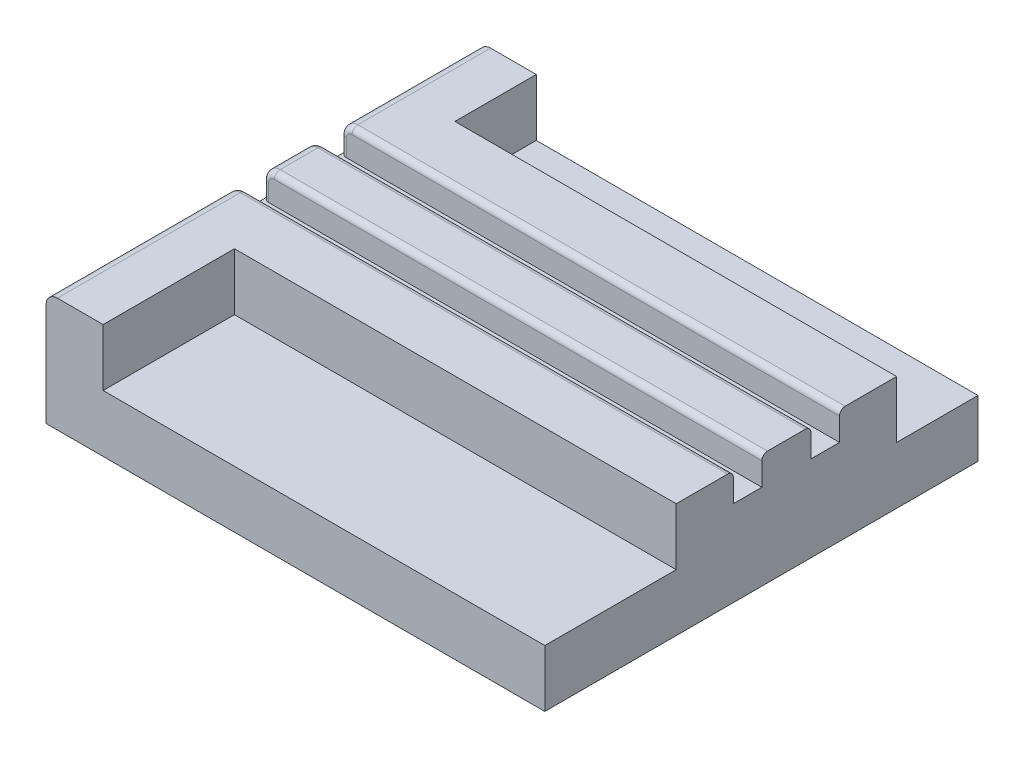
ISO-10303-21;
HEADER;
FILE_DESCRIPTION(('STEP AP214'),'2;1');
FILE_NAME('part.step','',(''),(''),'','','');
FILE_SCHEMA(('AUTOMOTIVE_DESIGN { 1 0 10303 214 1 1 1 1 }'));
ENDSEC;
DATA;
#1=APPLICATION_CONTEXT('core data for automotive mechanical design processes');
#2=APPLICATION_PROTOCOL_DEFINITION('international standard','automotive_design',2000,#1);
#3=PRODUCT_CONTEXT('',#1,'mechanical');
#4=PRODUCT('Part','Part','',(#3));
#5=PRODUCT_RELATED_PRODUCT_CATEGORY('part','',(#4));
#6=PRODUCT_DEFINITION_FORMATION('','',#4);
#7=PRODUCT_DEFINITION_CONTEXT('part definition',#1,'design');
#8=PRODUCT_DEFINITION('design','',#6,#7);
#9=PRODUCT_DEFINITION_SHAPE('','',#8);
#10=(LENGTH_UNIT() NAMED_UNIT(*) SI_UNIT(.MILLI.,.METRE.));
#11=(NAMED_UNIT(*) PLANE_ANGLE_UNIT() SI_UNIT($,.RADIAN.));
#12=(NAMED_UNIT(*) SI_UNIT($,.STERADIAN.) SOLID_ANGLE_UNIT());
#13=UNCERTAINTY_MEASURE_WITH_UNIT(LENGTH_MEASURE(1.E-05),#10,'distance_accuracy_value','');
#14=(GEOMETRIC_REPRESENTATION_CONTEXT(3) GLOBAL_UNCERTAINTY_ASSIGNED_CONTEXT((#13)) GLOBAL_UNIT_ASSIGNED_CONTEXT((#10,
#11,#12)) REPRESENTATION_CONTEXT('',''));
#15=CARTESIAN_POINT('',(0.,0.,0.));
#16=DIRECTION('',(0.,0.,1.));
#17=DIRECTION('',(1.,0.,0.));
#18=AXIS2_PLACEMENT_3D('',#15,#16,#17);
#19=CARTESIAN_POINT('',(0.,20.,0.));
#20=DIRECTION('',(0.,-1.,0.));
#21=DIRECTION('',(0.,0.,-1.));
#22=AXIS2_PLACEMENT_3D('',#19,#20,#21);
#23=PLANE('',#22);
#24=DIRECTION('',(0.,0.,1.));
#25=VECTOR('',#24,1.);
#26=CARTESIAN_POINT('',(-110.,20.,0.));
#27=LINE('',#26,#25);
#28=CARTESIAN_POINT('',(-110.,20.,0.));
#29=VERTEX_POINT('',#28);
#30=CARTESIAN_POINT('',(-110.,20.,14.25));
#31=VERTEX_POINT('',#30);
#32=EDGE_CURVE('E323',#29,#31,#27,.T.);
#33=ORIENTED_EDGE('',*,*,#32,.F.);
#34=DIRECTION('',(-1.,0.,0.));
#35=VECTOR('',#34,1.);
#36=CARTESIAN_POINT('',(0.,20.,0.));
#37=LINE('',#36,#35);
#38=CARTESIAN_POINT('',(-118.,20.,0.));
#39=VERTEX_POINT('',#38);
#40=EDGE_CURVE('E263',#29,#39,#37,.T.);
#41=ORIENTED_EDGE('',*,*,#40,.T.);
#42=DIRECTION('',(0.,0.,1.));
#43=VECTOR('',#42,1.);
#44=CARTESIAN_POINT('',(-118.,20.,0.));
#45=LINE('',#44,#43);
#46=CARTESIAN_POINT('',(-118.,20.,23.25));
#47=VERTEX_POINT('',#46);
#48=EDGE_CURVE('E65',#39,#47,#45,.T.);
#49=ORIENTED_EDGE('',*,*,#48,.T.);
#50=DIRECTION('',(1.,0.,0.));
#51=VECTOR('',#50,1.);
#52=CARTESIAN_POINT('',(-19.65,20.,23.25));
#53=LINE('',#52,#51);
#54=CARTESIAN_POINT('',(-32.65,20.,23.25));
#55=VERTEX_POINT('',#54);
#56=EDGE_CURVE('E411',#47,#55,#53,.T.);
#57=ORIENTED_EDGE('',*,*,#56,.T.);
#58=DIRECTION('',(0.,0.,1.));
#59=VECTOR('',#58,1.);
#60=CARTESIAN_POINT('',(-32.65,20.,-150.));
#61=LINE('',#60,#59);
#62=CARTESIAN_POINT('',(-32.65,20.,14.25));
#63=VERTEX_POINT('',#62);
#64=EDGE_CURVE('E254',#63,#55,#61,.T.);
#65=ORIENTED_EDGE('',*,*,#64,.F.);
#66=DIRECTION('',(1.,0.,0.));
#67=VECTOR('',#66,1.);
#68=CARTESIAN_POINT('',(-19.65,20.,14.25));
#69=LINE('',#68,#67);
#70=EDGE_CURVE('E317',#31,#63,#69,.T.);
#71=ORIENTED_EDGE('',*,*,#70,.F.);
#72=EDGE_LOOP('',(#33,#41,#49,#57,#65,#71));
#73=FACE_BOUND('',#72,.T.);
#74=ADVANCED_FACE('F43',(#73),#23,.F.);
#75=DIRECTION('',(-1.,0.,0.));
#76=VECTOR('',#75,1.);
#77=CARTESIAN_POINT('',(-19.65,20.,52.85));
#78=LINE('',#77,#76);
#79=CARTESIAN_POINT('',(-32.65,20.,52.85));
#80=VERTEX_POINT('',#79);
#81=CARTESIAN_POINT('',(-110.,20.,52.85));
#82=VERTEX_POINT('',#81);
#83=EDGE_CURVE('E318',#80,#82,#78,.T.);
#84=ORIENTED_EDGE('',*,*,#83,.F.);
#85=CARTESIAN_POINT('',(-32.65,20.,43.85));
#86=VERTEX_POINT('',#85);
#87=EDGE_CURVE('E261',#86,#80,#61,.T.);
#88=ORIENTED_EDGE('',*,*,#87,.F.);
#89=DIRECTION('',(-1.,0.,0.));
#90=VECTOR('',#89,1.);
#91=CARTESIAN_POINT('',(-118.,20.,43.85));
#92=LINE('',#91,#90);
#93=CARTESIAN_POINT('',(-118.,20.,43.85));
#94=VERTEX_POINT('',#93);
#95=EDGE_CURVE('E404',#86,#94,#92,.T.);
#96=ORIENTED_EDGE('',*,*,#95,.T.);
#97=CARTESIAN_POINT('',(-118.,20.,75.85));
#98=VERTEX_POINT('',#97);
#99=EDGE_CURVE('E348',#94,#98,#45,.T.);
#100=ORIENTED_EDGE('',*,*,#99,.T.);
#101=DIRECTION('',(-1.,0.,0.));
#102=VECTOR('',#101,1.);
#103=CARTESIAN_POINT('',(-32.65,20.,75.85));
#104=LINE('',#103,#102);
#105=CARTESIAN_POINT('',(-110.,20.,75.85));
#106=VERTEX_POINT('',#105);
#107=EDGE_CURVE('E296',#106,#98,#104,.T.);
#108=ORIENTED_EDGE('',*,*,#107,.F.);
#109=DIRECTION('',(0.,0.,-1.));
#110=VECTOR('',#109,1.);
#111=CARTESIAN_POINT('',(-110.,20.,100.));
#112=LINE('',#111,#110);
#113=EDGE_CURVE('E314',#106,#82,#112,.T.);
#114=ORIENTED_EDGE('',*,*,#113,.T.);
#115=EDGE_LOOP('',(#84,#88,#96,#100,#108,#114));
#116=FACE_BOUND('',#115,.T.);
#117=ADVANCED_FACE('F459',(#116),#23,.F.);
#118=DIRECTION('',(1.,0.,0.));
#119=VECTOR('',#118,1.);
#120=CARTESIAN_POINT('',(-19.65,20.,36.85));
#121=LINE('',#120,#119);
#122=CARTESIAN_POINT('',(-118.,20.,36.85));
#123=VERTEX_POINT('',#122);
#124=CARTESIAN_POINT('',(-32.65,20.,36.85));
#125=VERTEX_POINT('',#124);
#126=EDGE_CURVE('E408',#123,#125,#121,.T.);
#127=ORIENTED_EDGE('',*,*,#126,.T.);
#128=CARTESIAN_POINT('',(-32.65,20.,30.25));
#129=VERTEX_POINT('',#128);
#130=EDGE_CURVE('E259',#129,#125,#61,.T.);
#131=ORIENTED_EDGE('',*,*,#130,.F.);
#132=DIRECTION('',(-1.,0.,0.));
#133=VECTOR('',#132,1.);
#134=CARTESIAN_POINT('',(-118.,20.,30.25));
#135=LINE('',#134,#133);
#136=CARTESIAN_POINT('',(-118.,20.,30.25));
#137=VERTEX_POINT('',#136);
#138=EDGE_CURVE('E406',#129,#137,#135,.T.);
#139=ORIENTED_EDGE('',*,*,#138,.T.);
#140=EDGE_CURVE('E351',#137,#123,#45,.T.);
#141=ORIENTED_EDGE('',*,*,#140,.T.);
#142=EDGE_LOOP('',(#127,#131,#139,#141));
#143=FACE_BOUND('',#142,.T.);
#144=ADVANCED_FACE('F525',(#143),#23,.F.);
#145=CARTESIAN_POINT('',(-118.,18.,0.));
#146=DIRECTION('',(0.,0.,1.));
#147=DIRECTION('',(1.,0.,0.));
#148=AXIS2_PLACEMENT_3D('',#145,#146,#147);
#149=CYLINDRICAL_SURFACE('',#148,2.);
#150=DIRECTION('',(0.,0.,1.));
#151=VECTOR('',#150,1.);
#152=CARTESIAN_POINT('',(-120.,18.,100.));
#153=LINE('',#152,#151);
#154=CARTESIAN_POINT('',(-120.,18.,36.85));
#155=VERTEX_POINT('',#154);
#156=CARTESIAN_POINT('',(-120.,18.,30.25));
#157=VERTEX_POINT('',#156);
#158=EDGE_CURVE('E355',#155,#157,#153,.F.);
#159=ORIENTED_EDGE('',*,*,#158,.F.);
#160=CARTESIAN_POINT('',(-118.,18.,36.85));
#161=DIRECTION('',(0.,0.,1.));
#162=DIRECTION('',(1.,0.,0.));
#163=AXIS2_PLACEMENT_3D('',#160,#161,#162);
#164=CIRCLE('',#163,2.);
#165=EDGE_CURVE('E385',#155,#123,#164,.F.);
#166=ORIENTED_EDGE('',*,*,#165,.T.);
#167=ORIENTED_EDGE('',*,*,#140,.F.);
#168=CARTESIAN_POINT('',(-118.,18.,30.25));
#169=DIRECTION('',(0.,0.,-1.));
#170=DIRECTION('',(-1.,0.,0.));
#171=AXIS2_PLACEMENT_3D('',#168,#169,#170);
#172=CIRCLE('',#171,2.);
#173=EDGE_CURVE('E383',#137,#157,#172,.F.);
#174=ORIENTED_EDGE('',*,*,#173,.T.);
#175=EDGE_LOOP('',(#159,#166,#167,#174));
#176=FACE_BOUND('',#175,.T.);
#177=ADVANCED_FACE('F529',(#176),#149,.T.);
#178=CARTESIAN_POINT('',(-118.,18.,0.));
#179=DIRECTION('',(0.,0.,1.));
#180=DIRECTION('',(1.,0.,0.));
#181=AXIS2_PLACEMENT_3D('',#178,#179,#180);
#182=CIRCLE('',#181,2.);
#183=CARTESIAN_POINT('',(-120.,18.,0.));
#184=VERTEX_POINT('',#183);
#185=EDGE_CURVE('E477',#184,#39,#182,.F.);
#186=ORIENTED_EDGE('',*,*,#185,.F.);
#187=CARTESIAN_POINT('',(-120.,18.,23.25));
#188=VERTEX_POINT('',#187);
#189=EDGE_CURVE('E350',#188,#184,#153,.F.);
#190=ORIENTED_EDGE('',*,*,#189,.F.);
#191=CARTESIAN_POINT('',(-118.,18.,23.25));
#192=DIRECTION('',(0.,0.,1.));
#193=DIRECTION('',(1.,0.,0.));
#194=AXIS2_PLACEMENT_3D('',#191,#192,#193);
#195=CIRCLE('',#194,2.);
#196=EDGE_CURVE('E402',#188,#47,#195,.F.);
#197=ORIENTED_EDGE('',*,*,#196,.T.);
#198=ORIENTED_EDGE('',*,*,#48,.F.);
#199=EDGE_LOOP('',(#186,#190,#197,#198));
#200=FACE_BOUND('',#199,.T.);
#201=ADVANCED_FACE('F591',(#200),#149,.T.);
#202=CARTESIAN_POINT('',(-118.,18.,75.85));
#203=DIRECTION('',(0.,0.,-1.));
#204=DIRECTION('',(-1.,0.,0.));
#205=AXIS2_PLACEMENT_3D('',#202,#203,#204);
#206=CIRCLE('',#205,2.);
#207=CARTESIAN_POINT('',(-120.,18.,75.85));
#208=VERTEX_POINT('',#207);
#209=EDGE_CURVE('E304',#98,#208,#206,.F.);
#210=ORIENTED_EDGE('',*,*,#209,.F.);
#211=ORIENTED_EDGE('',*,*,#99,.F.);
#212=CARTESIAN_POINT('',(-118.,18.,43.85));
#213=DIRECTION('',(0.,0.,-1.));
#214=DIRECTION('',(-1.,0.,0.));
#215=AXIS2_PLACEMENT_3D('',#212,#213,#214);
#216=CIRCLE('',#215,2.);
#217=CARTESIAN_POINT('',(-120.,18.,43.85));
#218=VERTEX_POINT('',#217);
#219=EDGE_CURVE('E373',#94,#218,#216,.F.);
#220=ORIENTED_EDGE('',*,*,#219,.T.);
#221=EDGE_CURVE('E352',#208,#218,#153,.F.);
#222=ORIENTED_EDGE('',*,*,#221,.F.);
#223=EDGE_LOOP('',(#210,#211,#220,#222));
#224=FACE_BOUND('',#223,.T.);
#225=ADVANCED_FACE('F467',(#224),#149,.T.);
#226=CARTESIAN_POINT('',(-120.,20.,100.));
#227=DIRECTION('',(1.,0.,0.));
#228=DIRECTION('',(0.,0.,-1.));
#229=AXIS2_PLACEMENT_3D('',#226,#227,#228);
#230=PLANE('',#229);
#231=ORIENTED_EDGE('',*,*,#189,.T.);
#232=DIRECTION('',(0.,-1.,0.));
#233=VECTOR('',#232,1.);
#234=CARTESIAN_POINT('',(-120.,20.,0.));
#235=LINE('',#234,#233);
#236=CARTESIAN_POINT('',(-120.,0.,0.));
#237=VERTEX_POINT('',#236);
#238=EDGE_CURVE('E246',#184,#237,#235,.T.);
#239=ORIENTED_EDGE('',*,*,#238,.T.);
#240=DIRECTION('',(0.,0.,1.));
#241=VECTOR('',#240,1.);
#242=CARTESIAN_POINT('',(-120.,0.,100.));
#243=LINE('',#242,#241);
#244=CARTESIAN_POINT('',(-120.,0.,75.85));
#245=VERTEX_POINT('',#244);
#246=EDGE_CURVE('E245',#237,#245,#243,.T.);
#247=ORIENTED_EDGE('',*,*,#246,.T.);
#248=DIRECTION('',(0.,1.,0.));
#249=VECTOR('',#248,1.);
#250=CARTESIAN_POINT('',(-120.,20.,75.85));
#251=LINE('',#250,#249);
#252=EDGE_CURVE('E301',#245,#208,#251,.T.);
#253=ORIENTED_EDGE('',*,*,#252,.T.);
#254=ORIENTED_EDGE('',*,*,#221,.T.);
#255=DIRECTION('',(0.,1.,0.));
#256=VECTOR('',#255,1.);
#257=CARTESIAN_POINT('',(-120.,15.,43.85));
#258=LINE('',#257,#256);
#259=CARTESIAN_POINT('',(-120.,15.,43.85));
#260=VERTEX_POINT('',#259);
#261=EDGE_CURVE('E370',#218,#260,#258,.F.);
#262=ORIENTED_EDGE('',*,*,#261,.T.);
#263=DIRECTION('',(0.,0.,-1.));
#264=VECTOR('',#263,1.);
#265=CARTESIAN_POINT('',(-120.,15.,100.));
#266=LINE('',#265,#264);
#267=CARTESIAN_POINT('',(-120.,15.,36.85));
#268=VERTEX_POINT('',#267);
#269=EDGE_CURVE('E340',#260,#268,#266,.T.);
#270=ORIENTED_EDGE('',*,*,#269,.T.);
#271=DIRECTION('',(0.,-1.,0.));
#272=VECTOR('',#271,1.);
#273=CARTESIAN_POINT('',(-120.,18.,36.85));
#274=LINE('',#273,#272);
#275=EDGE_CURVE('E368',#268,#155,#274,.F.);
#276=ORIENTED_EDGE('',*,*,#275,.T.);
#277=ORIENTED_EDGE('',*,*,#158,.T.);
#278=DIRECTION('',(0.,1.,0.));
#279=VECTOR('',#278,1.);
#280=CARTESIAN_POINT('',(-120.,15.,30.25));
#281=LINE('',#280,#279);
#282=CARTESIAN_POINT('',(-120.,15.,30.25));
#283=VERTEX_POINT('',#282);
#284=EDGE_CURVE('E365',#157,#283,#281,.F.);
#285=ORIENTED_EDGE('',*,*,#284,.T.);
#286=DIRECTION('',(0.,0.,1.));
#287=VECTOR('',#286,1.);
#288=CARTESIAN_POINT('',(-120.,15.,100.));
#289=LINE('',#288,#287);
#290=CARTESIAN_POINT('',(-120.,15.,23.25));
#291=VERTEX_POINT('',#290);
#292=EDGE_CURVE('E345',#291,#283,#289,.T.);
#293=ORIENTED_EDGE('',*,*,#292,.F.);
#294=DIRECTION('',(0.,-1.,0.));
#295=VECTOR('',#294,1.);
#296=CARTESIAN_POINT('',(-120.,18.,23.25));
#297=LINE('',#296,#295);
#298=EDGE_CURVE('E363',#291,#188,#297,.F.);
#299=ORIENTED_EDGE('',*,*,#298,.T.);
#300=EDGE_LOOP('',(#231,#239,#247,#253,#254,#262,#270,#276,#277,#285,#293,#299));
#301=FACE_BOUND('',#300,.T.);
#302=ADVANCED_FACE('F473',(#301),#230,.F.);
#303=CARTESIAN_POINT('',(0.,0.,0.));
#304=DIRECTION('',(0.,-1.,0.));
#305=DIRECTION('',(0.,0.,-1.));
#306=AXIS2_PLACEMENT_3D('',#303,#304,#305);
#307=PLANE('',#306);
#308=DIRECTION('',(-1.,0.,0.));
#309=VECTOR('',#308,1.);
#310=CARTESIAN_POINT('',(0.,0.,0.));
#311=LINE('',#310,#309);
#312=CARTESIAN_POINT('',(-32.65,0.,0.));
#313=VERTEX_POINT('',#312);
#314=EDGE_CURVE('E234',#313,#237,#311,.T.);
#315=ORIENTED_EDGE('',*,*,#314,.F.);
#316=DIRECTION('',(0.,0.,1.));
#317=VECTOR('',#316,1.);
#318=CARTESIAN_POINT('',(-32.65,0.,-150.));
#319=LINE('',#318,#317);
#320=CARTESIAN_POINT('',(-32.65,0.,75.85));
#321=VERTEX_POINT('',#320);
#322=EDGE_CURVE('E243',#313,#321,#319,.T.);
#323=ORIENTED_EDGE('',*,*,#322,.T.);
#324=DIRECTION('',(-1.,0.,0.));
#325=VECTOR('',#324,1.);
#326=CARTESIAN_POINT('',(-32.65,0.,75.85));
#327=LINE('',#326,#325);
#328=EDGE_CURVE('E295',#321,#245,#327,.T.);
#329=ORIENTED_EDGE('',*,*,#328,.T.);
#330=ORIENTED_EDGE('',*,*,#246,.F.);
#331=EDGE_LOOP('',(#315,#323,#329,#330));
#332=FACE_BOUND('',#331,.T.);
#333=ADVANCED_FACE('F241',(#332),#307,.T.);
#334=CARTESIAN_POINT('',(0.,15.,0.));
#335=DIRECTION('',(0.,-1.,0.));
#336=DIRECTION('',(0.,0.,1.));
#337=AXIS2_PLACEMENT_3D('',#334,#335,#336);
#338=PLANE('',#337);
#339=DIRECTION('',(-1.,0.,0.));
#340=VECTOR('',#339,1.);
#341=CARTESIAN_POINT('',(-19.65,15.,42.85));
#342=LINE('',#341,#340);
#343=CARTESIAN_POINT('',(-32.65,15.,42.85));
#344=VERTEX_POINT('',#343);
#345=CARTESIAN_POINT('',(-119.,15.,42.85));
#346=VERTEX_POINT('',#345);
#347=EDGE_CURVE('E338',#344,#346,#342,.T.);
#348=ORIENTED_EDGE('',*,*,#347,.F.);
#349=DIRECTION('',(0.,0.,-1.));
#350=VECTOR('',#349,1.);
#351=CARTESIAN_POINT('',(-32.65,15.,0.));
#352=LINE('',#351,#350);
#353=CARTESIAN_POINT('',(-32.65,15.,37.85));
#354=VERTEX_POINT('',#353);
#355=EDGE_CURVE('E282',#344,#354,#352,.T.);
#356=ORIENTED_EDGE('',*,*,#355,.T.);
#357=DIRECTION('',(1.,0.,0.));
#358=VECTOR('',#357,1.);
#359=CARTESIAN_POINT('',(-19.65,15.,37.85));
#360=LINE('',#359,#358);
#361=CARTESIAN_POINT('',(-119.,15.,37.85));
#362=VERTEX_POINT('',#361);
#363=EDGE_CURVE('E333',#362,#354,#360,.T.);
#364=ORIENTED_EDGE('',*,*,#363,.F.);
#365=CARTESIAN_POINT('',(-119.,15.,36.85));
#366=DIRECTION('',(0.,-1.,0.));
#367=DIRECTION('',(0.,0.,-1.));
#368=AXIS2_PLACEMENT_3D('',#365,#366,#367);
#369=CIRCLE('',#368,1.);
#370=EDGE_CURVE('E416',#362,#268,#369,.T.);
#371=ORIENTED_EDGE('',*,*,#370,.T.);
#372=ORIENTED_EDGE('',*,*,#269,.F.);
#373=CARTESIAN_POINT('',(-119.,15.,43.85));
#374=DIRECTION('',(0.,-1.,0.));
#375=DIRECTION('',(0.,0.,-1.));
#376=AXIS2_PLACEMENT_3D('',#373,#374,#375);
#377=CIRCLE('',#376,1.);
#378=EDGE_CURVE('E413',#260,#346,#377,.T.);
#379=ORIENTED_EDGE('',*,*,#378,.T.);
#380=EDGE_LOOP('',(#348,#356,#364,#371,#372,#379));
#381=FACE_BOUND('',#380,.T.);
#382=ADVANCED_FACE('F547',(#381),#338,.F.);
#383=CARTESIAN_POINT('',(-19.65,15.,42.85));
#384=DIRECTION('',(0.,0.,-1.));
#385=DIRECTION('',(-1.,0.,0.));
#386=AXIS2_PLACEMENT_3D('',#383,#384,#385);
#387=PLANE('',#386);
#388=DIRECTION('',(0.,1.,0.));
#389=VECTOR('',#388,1.);
#390=CARTESIAN_POINT('',(-32.65,15.,42.85));
#391=LINE('',#390,#389);
#392=CARTESIAN_POINT('',(-32.65,19.,42.85));
#393=VERTEX_POINT('',#392);
#394=EDGE_CURVE('E285',#344,#393,#391,.T.);
#395=ORIENTED_EDGE('',*,*,#394,.F.);
#396=ORIENTED_EDGE('',*,*,#347,.T.);
#397=DIRECTION('',(0.,1.,0.));
#398=VECTOR('',#397,1.);
#399=CARTESIAN_POINT('',(-119.,18.,42.85));
#400=LINE('',#399,#398);
#401=CARTESIAN_POINT('',(-119.,18.,42.85));
#402=VERTEX_POINT('',#401);
#403=EDGE_CURVE('E360',#346,#402,#400,.T.);
#404=ORIENTED_EDGE('',*,*,#403,.T.);
#405=CARTESIAN_POINT('',(-118.,18.,42.85));
#406=DIRECTION('',(0.,0.,-1.));
#407=DIRECTION('',(-1.,0.,0.));
#408=AXIS2_PLACEMENT_3D('',#405,#406,#407);
#409=CIRCLE('',#408,1.);
#410=CARTESIAN_POINT('',(-118.,19.,42.85));
#411=VERTEX_POINT('',#410);
#412=EDGE_CURVE('E358',#402,#411,#409,.T.);
#413=ORIENTED_EDGE('',*,*,#412,.T.);
#414=DIRECTION('',(-1.,0.,0.));
#415=VECTOR('',#414,1.);
#416=CARTESIAN_POINT('',(-19.65,19.,42.85));
#417=LINE('',#416,#415);
#418=EDGE_CURVE('E354',#411,#393,#417,.F.);
#419=ORIENTED_EDGE('',*,*,#418,.T.);
#420=EDGE_LOOP('',(#395,#396,#404,#413,#419));
#421=FACE_BOUND('',#420,.T.);
#422=ADVANCED_FACE('F551',(#421),#387,.T.);
#423=CARTESIAN_POINT('',(-19.65,15.,37.85));
#424=DIRECTION('',(0.,0.,1.));
#425=DIRECTION('',(1.,0.,0.));
#426=AXIS2_PLACEMENT_3D('',#423,#424,#425);
#427=PLANE('',#426);
#428=DIRECTION('',(0.,-1.,0.));
#429=VECTOR('',#428,1.);
#430=CARTESIAN_POINT('',(-32.65,15.,37.85));
#431=LINE('',#430,#429);
#432=CARTESIAN_POINT('',(-32.65,19.,37.85));
#433=VERTEX_POINT('',#432);
#434=EDGE_CURVE('E280',#433,#354,#431,.T.);
#435=ORIENTED_EDGE('',*,*,#434,.F.);
#436=DIRECTION('',(1.,0.,0.));
#437=VECTOR('',#436,1.);
#438=CARTESIAN_POINT('',(-118.,19.,37.85));
#439=LINE('',#438,#437);
#440=CARTESIAN_POINT('',(-118.,19.,37.85));
#441=VERTEX_POINT('',#440);
#442=EDGE_CURVE('E376',#433,#441,#439,.F.);
#443=ORIENTED_EDGE('',*,*,#442,.T.);
#444=CARTESIAN_POINT('',(-118.,18.,37.85));
#445=DIRECTION('',(0.,0.,1.));
#446=DIRECTION('',(1.,0.,0.));
#447=AXIS2_PLACEMENT_3D('',#444,#445,#446);
#448=CIRCLE('',#447,1.);
#449=CARTESIAN_POINT('',(-119.,18.,37.85));
#450=VERTEX_POINT('',#449);
#451=EDGE_CURVE('E378',#441,#450,#448,.T.);
#452=ORIENTED_EDGE('',*,*,#451,.T.);
#453=DIRECTION('',(0.,-1.,0.));
#454=VECTOR('',#453,1.);
#455=CARTESIAN_POINT('',(-119.,15.,37.85));
#456=LINE('',#455,#454);
#457=EDGE_CURVE('E380',#450,#362,#456,.T.);
#458=ORIENTED_EDGE('',*,*,#457,.T.);
#459=ORIENTED_EDGE('',*,*,#363,.T.);
#460=EDGE_LOOP('',(#435,#443,#452,#458,#459));
#461=FACE_BOUND('',#460,.T.);
#462=ADVANCED_FACE('F544',(#461),#427,.T.);
#463=CARTESIAN_POINT('',(0.,15.,0.));
#464=DIRECTION('',(0.,1.,0.));
#465=DIRECTION('',(0.,0.,-1.));
#466=AXIS2_PLACEMENT_3D('',#463,#464,#465);
#467=PLANE('',#466);
#468=DIRECTION('',(0.,0.,1.));
#469=VECTOR('',#468,1.);
#470=CARTESIAN_POINT('',(-32.65,15.,0.));
#471=LINE('',#470,#469);
#472=CARTESIAN_POINT('',(-32.65,15.,24.25));
#473=VERTEX_POINT('',#472);
#474=CARTESIAN_POINT('',(-32.65,15.,29.25));
#475=VERTEX_POINT('',#474);
#476=EDGE_CURVE('E272',#473,#475,#471,.T.);
#477=ORIENTED_EDGE('',*,*,#476,.F.);
#478=DIRECTION('',(1.,0.,0.));
#479=VECTOR('',#478,1.);
#480=CARTESIAN_POINT('',(-19.65,15.,24.25));
#481=LINE('',#480,#479);
#482=CARTESIAN_POINT('',(-119.,15.,24.25));
#483=VERTEX_POINT('',#482);
#484=EDGE_CURVE('E334',#483,#473,#481,.T.);
#485=ORIENTED_EDGE('',*,*,#484,.F.);
#486=CARTESIAN_POINT('',(-119.,15.,23.25));
#487=DIRECTION('',(0.,1.,0.));
#488=DIRECTION('',(0.,0.,1.));
#489=AXIS2_PLACEMENT_3D('',#486,#487,#488);
#490=CIRCLE('',#489,1.);
#491=EDGE_CURVE('E422',#483,#291,#490,.F.);
#492=ORIENTED_EDGE('',*,*,#491,.T.);
#493=ORIENTED_EDGE('',*,*,#292,.T.);
#494=CARTESIAN_POINT('',(-119.,15.,30.25));
#495=DIRECTION('',(0.,1.,0.));
#496=DIRECTION('',(0.,0.,1.));
#497=AXIS2_PLACEMENT_3D('',#494,#495,#496);
#498=CIRCLE('',#497,1.);
#499=CARTESIAN_POINT('',(-119.,15.,29.25));
#500=VERTEX_POINT('',#499);
#501=EDGE_CURVE('E419',#283,#500,#498,.F.);
#502=ORIENTED_EDGE('',*,*,#501,.T.);
#503=DIRECTION('',(-1.,0.,0.));
#504=VECTOR('',#503,1.);
#505=CARTESIAN_POINT('',(-19.65,15.,29.25));
#506=LINE('',#505,#504);
#507=EDGE_CURVE('E337',#475,#500,#506,.T.);
#508=ORIENTED_EDGE('',*,*,#507,.F.);
#509=EDGE_LOOP('',(#477,#485,#492,#493,#502,#508));
#510=FACE_BOUND('',#509,.T.);
#511=ADVANCED_FACE('F509',(#510),#467,.T.);
#512=CARTESIAN_POINT('',(-19.65,15.,29.25));
#513=DIRECTION('',(0.,0.,-1.));
#514=DIRECTION('',(-1.,0.,0.));
#515=AXIS2_PLACEMENT_3D('',#512,#513,#514);
#516=PLANE('',#515);
#517=DIRECTION('',(0.,1.,0.));
#518=VECTOR('',#517,1.);
#519=CARTESIAN_POINT('',(-32.65,15.,29.25));
#520=LINE('',#519,#518);
#521=CARTESIAN_POINT('',(-32.65,19.,29.25));
#522=VERTEX_POINT('',#521);
#523=EDGE_CURVE('E274',#475,#522,#520,.T.);
#524=ORIENTED_EDGE('',*,*,#523,.F.);
#525=ORIENTED_EDGE('',*,*,#507,.T.);
#526=DIRECTION('',(0.,1.,0.));
#527=VECTOR('',#526,1.);
#528=CARTESIAN_POINT('',(-119.,18.,29.25));
#529=LINE('',#528,#527);
#530=CARTESIAN_POINT('',(-119.,18.,29.25));
#531=VERTEX_POINT('',#530);
#532=EDGE_CURVE('E392',#500,#531,#529,.T.);
#533=ORIENTED_EDGE('',*,*,#532,.T.);
#534=CARTESIAN_POINT('',(-118.,18.,29.25));
#535=DIRECTION('',(0.,0.,-1.));
#536=DIRECTION('',(-1.,0.,0.));
#537=AXIS2_PLACEMENT_3D('',#534,#535,#536);
#538=CIRCLE('',#537,1.);
#539=CARTESIAN_POINT('',(-118.,19.,29.25));
#540=VERTEX_POINT('',#539);
#541=EDGE_CURVE('E390',#531,#540,#538,.T.);
#542=ORIENTED_EDGE('',*,*,#541,.T.);
#543=DIRECTION('',(-1.,0.,0.));
#544=VECTOR('',#543,1.);
#545=CARTESIAN_POINT('',(-19.65,19.,29.25));
#546=LINE('',#545,#544);
#547=EDGE_CURVE('E387',#540,#522,#546,.F.);
#548=ORIENTED_EDGE('',*,*,#547,.T.);
#549=EDGE_LOOP('',(#524,#525,#533,#542,#548));
#550=FACE_BOUND('',#549,.T.);
#551=ADVANCED_FACE('F513',(#550),#516,.T.);
#552=CARTESIAN_POINT('',(-19.65,15.,24.25));
#553=DIRECTION('',(0.,0.,1.));
#554=DIRECTION('',(1.,0.,0.));
#555=AXIS2_PLACEMENT_3D('',#552,#553,#554);
#556=PLANE('',#555);
#557=DIRECTION('',(0.,-1.,0.));
#558=VECTOR('',#557,1.);
#559=CARTESIAN_POINT('',(-32.65,15.,24.25));
#560=LINE('',#559,#558);
#561=CARTESIAN_POINT('',(-32.65,19.,24.25));
#562=VERTEX_POINT('',#561);
#563=EDGE_CURVE('E270',#562,#473,#560,.T.);
#564=ORIENTED_EDGE('',*,*,#563,.F.);
#565=DIRECTION('',(1.,0.,0.));
#566=VECTOR('',#565,1.);
#567=CARTESIAN_POINT('',(-118.,19.,24.25));
#568=LINE('',#567,#566);
#569=CARTESIAN_POINT('',(-118.,19.,24.25));
#570=VERTEX_POINT('',#569);
#571=EDGE_CURVE('E395',#562,#570,#568,.F.);
#572=ORIENTED_EDGE('',*,*,#571,.T.);
#573=CARTESIAN_POINT('',(-118.,18.,24.25));
#574=DIRECTION('',(0.,0.,1.));
#575=DIRECTION('',(1.,0.,0.));
#576=AXIS2_PLACEMENT_3D('',#573,#574,#575);
#577=CIRCLE('',#576,1.);
#578=CARTESIAN_POINT('',(-119.,18.,24.25));
#579=VERTEX_POINT('',#578);
#580=EDGE_CURVE('E397',#570,#579,#577,.T.);
#581=ORIENTED_EDGE('',*,*,#580,.T.);
#582=DIRECTION('',(0.,-1.,0.));
#583=VECTOR('',#582,1.);
#584=CARTESIAN_POINT('',(-119.,15.,24.25));
#585=LINE('',#584,#583);
#586=EDGE_CURVE('E399',#579,#483,#585,.T.);
#587=ORIENTED_EDGE('',*,*,#586,.T.);
#588=ORIENTED_EDGE('',*,*,#484,.T.);
#589=EDGE_LOOP('',(#564,#572,#581,#587,#588));
#590=FACE_BOUND('',#589,.T.);
#591=ADVANCED_FACE('F502',(#590),#556,.T.);
#592=CARTESIAN_POINT('',(-19.65,15.,52.85));
#593=DIRECTION('',(0.,0.,-1.));
#594=DIRECTION('',(-1.,0.,0.));
#595=AXIS2_PLACEMENT_3D('',#592,#593,#594);
#596=PLANE('',#595);
#597=DIRECTION('',(1.,0.,0.));
#598=VECTOR('',#597,1.);
#599=CARTESIAN_POINT('',(0.,10.,52.85));
#600=LINE('',#599,#598);
#601=CARTESIAN_POINT('',(-110.,10.,52.85));
#602=VERTEX_POINT('',#601);
#603=CARTESIAN_POINT('',(-32.65,10.,52.85));
#604=VERTEX_POINT('',#603);
#605=EDGE_CURVE('E330',#602,#604,#600,.T.);
#606=ORIENTED_EDGE('',*,*,#605,.T.);
#607=DIRECTION('',(0.,1.,0.));
#608=VECTOR('',#607,1.);
#609=CARTESIAN_POINT('',(-32.65,15.,52.85));
#610=LINE('',#609,#608);
#611=EDGE_CURVE('E257',#604,#80,#610,.T.);
#612=ORIENTED_EDGE('',*,*,#611,.T.);
#613=ORIENTED_EDGE('',*,*,#83,.T.);
#614=DIRECTION('',(0.,1.,0.));
#615=VECTOR('',#614,1.);
#616=CARTESIAN_POINT('',(-110.,20.,52.85));
#617=LINE('',#616,#615);
#618=EDGE_CURVE('E311',#602,#82,#617,.T.);
#619=ORIENTED_EDGE('',*,*,#618,.F.);
#620=EDGE_LOOP('',(#606,#612,#613,#619));
#621=FACE_BOUND('',#620,.T.);
#622=ADVANCED_FACE('F631',(#621),#596,.F.);
#623=CARTESIAN_POINT('',(-110.,20.,100.));
#624=DIRECTION('',(1.,0.,0.));
#625=DIRECTION('',(0.,0.,-1.));
#626=AXIS2_PLACEMENT_3D('',#623,#624,#625);
#627=PLANE('',#626);
#628=DIRECTION('',(0.,1.,0.));
#629=VECTOR('',#628,1.);
#630=CARTESIAN_POINT('',(-110.,20.,75.85));
#631=LINE('',#630,#629);
#632=CARTESIAN_POINT('',(-110.,10.,75.85));
#633=VERTEX_POINT('',#632);
#634=EDGE_CURVE('E298',#633,#106,#631,.T.);
#635=ORIENTED_EDGE('',*,*,#634,.F.);
#636=DIRECTION('',(0.,0.,1.));
#637=VECTOR('',#636,1.);
#638=CARTESIAN_POINT('',(-110.,10.,0.));
#639=LINE('',#638,#637);
#640=EDGE_CURVE('E310',#602,#633,#639,.T.);
#641=ORIENTED_EDGE('',*,*,#640,.F.);
#642=ORIENTED_EDGE('',*,*,#618,.T.);
#643=ORIENTED_EDGE('',*,*,#113,.F.);
#644=EDGE_LOOP('',(#635,#641,#642,#643));
#645=FACE_BOUND('',#644,.T.);
#646=ADVANCED_FACE('F455',(#645),#627,.T.);
#647=CARTESIAN_POINT('',(0.,10.,0.));
#648=DIRECTION('',(0.,-1.,0.));
#649=DIRECTION('',(0.,0.,-1.));
#650=AXIS2_PLACEMENT_3D('',#647,#648,#649);
#651=PLANE('',#650);
#652=DIRECTION('',(1.,0.,0.));
#653=VECTOR('',#652,1.);
#654=CARTESIAN_POINT('',(0.,10.,75.85));
#655=LINE('',#654,#653);
#656=CARTESIAN_POINT('',(-32.65,10.,75.85));
#657=VERTEX_POINT('',#656);
#658=EDGE_CURVE('E51',#633,#657,#655,.T.);
#659=ORIENTED_EDGE('',*,*,#658,.T.);
#660=DIRECTION('',(0.,0.,-1.));
#661=VECTOR('',#660,1.);
#662=CARTESIAN_POINT('',(-32.65,10.,0.));
#663=LINE('',#662,#661);
#664=EDGE_CURVE('E253',#657,#604,#663,.T.);
#665=ORIENTED_EDGE('',*,*,#664,.T.);
#666=ORIENTED_EDGE('',*,*,#605,.F.);
#667=ORIENTED_EDGE('',*,*,#640,.T.);
#668=EDGE_LOOP('',(#659,#665,#666,#667));
#669=FACE_BOUND('',#668,.T.);
#670=ADVANCED_FACE('F447',(#669),#651,.F.);
#671=CARTESIAN_POINT('',(-19.65,15.,14.25));
#672=DIRECTION('',(0.,0.,1.));
#673=DIRECTION('',(1.,0.,0.));
#674=AXIS2_PLACEMENT_3D('',#671,#672,#673);
#675=PLANE('',#674);
#676=ORIENTED_EDGE('',*,*,#70,.T.);
#677=DIRECTION('',(0.,-1.,0.));
#678=VECTOR('',#677,1.);
#679=CARTESIAN_POINT('',(-32.65,15.,14.25));
#680=LINE('',#679,#678);
#681=CARTESIAN_POINT('',(-32.65,10.,14.25));
#682=VERTEX_POINT('',#681);
#683=EDGE_CURVE('E291',#63,#682,#680,.T.);
#684=ORIENTED_EDGE('',*,*,#683,.T.);
#685=DIRECTION('',(1.,0.,0.));
#686=VECTOR('',#685,1.);
#687=CARTESIAN_POINT('',(-19.65,10.,14.25));
#688=LINE('',#687,#686);
#689=CARTESIAN_POINT('',(-110.,10.,14.25));
#690=VERTEX_POINT('',#689);
#691=EDGE_CURVE('E325',#690,#682,#688,.T.);
#692=ORIENTED_EDGE('',*,*,#691,.F.);
#693=DIRECTION('',(0.,-1.,0.));
#694=VECTOR('',#693,1.);
#695=CARTESIAN_POINT('',(-110.,20.,14.25));
#696=LINE('',#695,#694);
#697=EDGE_CURVE('E307',#31,#690,#696,.T.);
#698=ORIENTED_EDGE('',*,*,#697,.F.);
#699=EDGE_LOOP('',(#676,#684,#692,#698));
#700=FACE_BOUND('',#699,.T.);
#701=ADVANCED_FACE('F492',(#700),#675,.F.);
#702=DIRECTION('',(0.,-1.,0.));
#703=VECTOR('',#702,1.);
#704=CARTESIAN_POINT('',(-110.,20.,0.));
#705=LINE('',#704,#703);
#706=CARTESIAN_POINT('',(-110.,10.,0.));
#707=VERTEX_POINT('',#706);
#708=EDGE_CURVE('E247',#29,#707,#705,.T.);
#709=ORIENTED_EDGE('',*,*,#708,.F.);
#710=ORIENTED_EDGE('',*,*,#32,.T.);
#711=ORIENTED_EDGE('',*,*,#697,.T.);
#712=EDGE_CURVE('E312',#707,#690,#639,.T.);
#713=ORIENTED_EDGE('',*,*,#712,.F.);
#714=EDGE_LOOP('',(#709,#710,#711,#713));
#715=FACE_BOUND('',#714,.T.);
#716=ADVANCED_FACE('F487',(#715),#627,.T.);
#717=DIRECTION('',(0.,0.,-1.));
#718=VECTOR('',#717,1.);
#719=CARTESIAN_POINT('',(-32.65,10.,0.));
#720=LINE('',#719,#718);
#721=CARTESIAN_POINT('',(-32.65,10.,0.));
#722=VERTEX_POINT('',#721);
#723=EDGE_CURVE('E289',#682,#722,#720,.T.);
#724=ORIENTED_EDGE('',*,*,#723,.T.);
#725=DIRECTION('',(-1.,0.,0.));
#726=VECTOR('',#725,1.);
#727=CARTESIAN_POINT('',(0.,10.,0.));
#728=LINE('',#727,#726);
#729=EDGE_CURVE('E58',#722,#707,#728,.T.);
#730=ORIENTED_EDGE('',*,*,#729,.T.);
#731=ORIENTED_EDGE('',*,*,#712,.T.);
#732=ORIENTED_EDGE('',*,*,#691,.T.);
#733=EDGE_LOOP('',(#724,#730,#731,#732));
#734=FACE_BOUND('',#733,.T.);
#735=ADVANCED_FACE('F483',(#734),#651,.F.);
#736=CARTESIAN_POINT('',(0.,19.,43.85));
#737=DIRECTION('',(1.,0.,0.));
#738=DIRECTION('',(0.,0.,-1.));
#739=AXIS2_PLACEMENT_3D('',#736,#737,#738);
#740=CYLINDRICAL_SURFACE('',#739,1.);
#741=CARTESIAN_POINT('',(-32.65,19.,43.85));
#742=DIRECTION('',(-1.,0.,0.));
#743=DIRECTION('',(0.,0.,1.));
#744=AXIS2_PLACEMENT_3D('',#741,#742,#743);
#745=CIRCLE('',#744,1.);
#746=EDGE_CURVE('E287',#393,#86,#745,.F.);
#747=ORIENTED_EDGE('',*,*,#746,.F.);
#748=ORIENTED_EDGE('',*,*,#418,.F.);
#749=CARTESIAN_POINT('',(-118.,19.,43.85));
#750=DIRECTION('',(-1.,0.,0.));
#751=DIRECTION('',(0.,0.,1.));
#752=AXIS2_PLACEMENT_3D('',#749,#750,#751);
#753=CIRCLE('',#752,1.);
#754=EDGE_CURVE('E320',#94,#411,#753,.T.);
#755=ORIENTED_EDGE('',*,*,#754,.F.);
#756=ORIENTED_EDGE('',*,*,#95,.F.);
#757=EDGE_LOOP('',(#747,#748,#755,#756));
#758=FACE_BOUND('',#757,.T.);
#759=ADVANCED_FACE('F555',(#758),#740,.T.);
#760=CARTESIAN_POINT('',(-118.,18.,43.85));
#761=DIRECTION('',(0.,0.,-1.));
#762=DIRECTION('',(-1.,0.,0.));
#763=AXIS2_PLACEMENT_3D('',#760,#761,#762);
#764=DEGENERATE_TOROIDAL_SURFACE('',#763,1.,1.,.T.);
#765=ORIENTED_EDGE('',*,*,#754,.T.);
#766=ORIENTED_EDGE('',*,*,#412,.F.);
#767=CARTESIAN_POINT('',(-119.,18.,43.85));
#768=DIRECTION('',(0.,-1.,0.));
#769=DIRECTION('',(0.,0.,-1.));
#770=AXIS2_PLACEMENT_3D('',#767,#768,#769);
#771=CIRCLE('',#770,1.);
#772=EDGE_CURVE('E425',#218,#402,#771,.T.);
#773=ORIENTED_EDGE('',*,*,#772,.F.);
#774=ORIENTED_EDGE('',*,*,#219,.F.);
#775=EDGE_LOOP('',(#765,#766,#773,#774));
#776=FACE_BOUND('',#775,.T.);
#777=ADVANCED_FACE('F558',(#776),#764,.T.);
#778=CARTESIAN_POINT('',(-119.,15.,43.85));
#779=DIRECTION('',(0.,-1.,0.));
#780=DIRECTION('',(0.,0.,-1.));
#781=AXIS2_PLACEMENT_3D('',#778,#779,#780);
#782=CYLINDRICAL_SURFACE('',#781,1.);
#783=ORIENTED_EDGE('',*,*,#378,.F.);
#784=ORIENTED_EDGE('',*,*,#261,.F.);
#785=ORIENTED_EDGE('',*,*,#772,.T.);
#786=ORIENTED_EDGE('',*,*,#403,.F.);
#787=EDGE_LOOP('',(#783,#784,#785,#786));
#788=FACE_BOUND('',#787,.T.);
#789=ADVANCED_FACE('F562',(#788),#782,.T.);
#790=CARTESIAN_POINT('',(0.,19.,36.85));
#791=DIRECTION('',(-1.,0.,0.));
#792=DIRECTION('',(0.,0.,1.));
#793=AXIS2_PLACEMENT_3D('',#790,#791,#792);
#794=CYLINDRICAL_SURFACE('',#793,1.);
#795=CARTESIAN_POINT('',(-32.65,19.,36.85));
#796=DIRECTION('',(-1.,0.,0.));
#797=DIRECTION('',(0.,0.,1.));
#798=AXIS2_PLACEMENT_3D('',#795,#796,#797);
#799=CIRCLE('',#798,1.);
#800=EDGE_CURVE('E278',#125,#433,#799,.F.);
#801=ORIENTED_EDGE('',*,*,#800,.F.);
#802=ORIENTED_EDGE('',*,*,#126,.F.);
#803=CARTESIAN_POINT('',(-118.,19.,36.85));
#804=DIRECTION('',(-1.,0.,0.));
#805=DIRECTION('',(0.,0.,1.));
#806=AXIS2_PLACEMENT_3D('',#803,#804,#805);
#807=CIRCLE('',#806,1.);
#808=EDGE_CURVE('E427',#441,#123,#807,.T.);
#809=ORIENTED_EDGE('',*,*,#808,.F.);
#810=ORIENTED_EDGE('',*,*,#442,.F.);
#811=EDGE_LOOP('',(#801,#802,#809,#810));
#812=FACE_BOUND('',#811,.T.);
#813=ADVANCED_FACE('F742',(#812),#794,.T.);
#814=CARTESIAN_POINT('',(-118.,18.,36.85));
#815=DIRECTION('',(0.,0.,1.));
#816=DIRECTION('',(1.,0.,0.));
#817=AXIS2_PLACEMENT_3D('',#814,#815,#816);
#818=DEGENERATE_TOROIDAL_SURFACE('',#817,1.,1.,.T.);
#819=ORIENTED_EDGE('',*,*,#808,.T.);
#820=ORIENTED_EDGE('',*,*,#165,.F.);
#821=CARTESIAN_POINT('',(-119.,18.,36.85));
#822=DIRECTION('',(0.,-1.,0.));
#823=DIRECTION('',(0.,0.,-1.));
#824=AXIS2_PLACEMENT_3D('',#821,#822,#823);
#825=CIRCLE('',#824,1.);
#826=EDGE_CURVE('E430',#450,#155,#825,.T.);
#827=ORIENTED_EDGE('',*,*,#826,.F.);
#828=ORIENTED_EDGE('',*,*,#451,.F.);
#829=EDGE_LOOP('',(#819,#820,#827,#828));
#830=FACE_BOUND('',#829,.T.);
#831=ADVANCED_FACE('F534',(#830),#818,.T.);
#832=CARTESIAN_POINT('',(-119.,15.,36.85));
#833=DIRECTION('',(0.,1.,0.));
#834=DIRECTION('',(0.,0.,1.));
#835=AXIS2_PLACEMENT_3D('',#832,#833,#834);
#836=CYLINDRICAL_SURFACE('',#835,1.);
#837=ORIENTED_EDGE('',*,*,#826,.T.);
#838=ORIENTED_EDGE('',*,*,#275,.F.);
#839=ORIENTED_EDGE('',*,*,#370,.F.);
#840=ORIENTED_EDGE('',*,*,#457,.F.);
#841=EDGE_LOOP('',(#837,#838,#839,#840));
#842=FACE_BOUND('',#841,.T.);
#843=ADVANCED_FACE('F540',(#842),#836,.T.);
#844=CARTESIAN_POINT('',(0.,19.,30.25));
#845=DIRECTION('',(1.,0.,0.));
#846=DIRECTION('',(0.,0.,-1.));
#847=AXIS2_PLACEMENT_3D('',#844,#845,#846);
#848=CYLINDRICAL_SURFACE('',#847,1.);
#849=CARTESIAN_POINT('',(-32.65,19.,30.25));
#850=DIRECTION('',(-1.,0.,0.));
#851=DIRECTION('',(0.,0.,1.));
#852=AXIS2_PLACEMENT_3D('',#849,#850,#851);
#853=CIRCLE('',#852,1.);
#854=EDGE_CURVE('E276',#522,#129,#853,.F.);
#855=ORIENTED_EDGE('',*,*,#854,.F.);
#856=ORIENTED_EDGE('',*,*,#547,.F.);
#857=CARTESIAN_POINT('',(-118.,19.,30.25));
#858=DIRECTION('',(-1.,0.,0.));
#859=DIRECTION('',(0.,0.,1.));
#860=AXIS2_PLACEMENT_3D('',#857,#858,#859);
#861=CIRCLE('',#860,1.);
#862=EDGE_CURVE('E433',#137,#540,#861,.T.);
#863=ORIENTED_EDGE('',*,*,#862,.F.);
#864=ORIENTED_EDGE('',*,*,#138,.F.);
#865=EDGE_LOOP('',(#855,#856,#863,#864));
#866=FACE_BOUND('',#865,.T.);
#867=ADVANCED_FACE('F519',(#866),#848,.T.);
#868=CARTESIAN_POINT('',(-118.,18.,30.25));
#869=DIRECTION('',(0.,0.,-1.));
#870=DIRECTION('',(-1.,0.,0.));
#871=AXIS2_PLACEMENT_3D('',#868,#869,#870);
#872=DEGENERATE_TOROIDAL_SURFACE('',#871,1.,1.,.T.);
#873=ORIENTED_EDGE('',*,*,#862,.T.);
#874=ORIENTED_EDGE('',*,*,#541,.F.);
#875=CARTESIAN_POINT('',(-119.,18.,30.25));
#876=DIRECTION('',(0.,-1.,0.));
#877=DIRECTION('',(0.,0.,-1.));
#878=AXIS2_PLACEMENT_3D('',#875,#876,#877);
#879=CIRCLE('',#878,1.);
#880=EDGE_CURVE('E436',#157,#531,#879,.T.);
#881=ORIENTED_EDGE('',*,*,#880,.F.);
#882=ORIENTED_EDGE('',*,*,#173,.F.);
#883=EDGE_LOOP('',(#873,#874,#881,#882));
#884=FACE_BOUND('',#883,.T.);
#885=ADVANCED_FACE('F569',(#884),#872,.T.);
#886=CARTESIAN_POINT('',(-119.,15.,30.25));
#887=DIRECTION('',(0.,-1.,0.));
#888=DIRECTION('',(0.,0.,-1.));
#889=AXIS2_PLACEMENT_3D('',#886,#887,#888);
#890=CYLINDRICAL_SURFACE('',#889,1.);
#891=ORIENTED_EDGE('',*,*,#501,.F.);
#892=ORIENTED_EDGE('',*,*,#284,.F.);
#893=ORIENTED_EDGE('',*,*,#880,.T.);
#894=ORIENTED_EDGE('',*,*,#532,.F.);
#895=EDGE_LOOP('',(#891,#892,#893,#894));
#896=FACE_BOUND('',#895,.T.);
#897=ADVANCED_FACE('F566',(#896),#890,.T.);
#898=CARTESIAN_POINT('',(0.,19.,23.25));
#899=DIRECTION('',(-1.,0.,0.));
#900=DIRECTION('',(0.,0.,1.));
#901=AXIS2_PLACEMENT_3D('',#898,#899,#900);
#902=CYLINDRICAL_SURFACE('',#901,1.);
#903=CARTESIAN_POINT('',(-32.65,19.,23.25));
#904=DIRECTION('',(-1.,0.,0.));
#905=DIRECTION('',(0.,0.,1.));
#906=AXIS2_PLACEMENT_3D('',#903,#904,#905);
#907=CIRCLE('',#906,1.);
#908=EDGE_CURVE('E268',#55,#562,#907,.F.);
#909=ORIENTED_EDGE('',*,*,#908,.F.);
#910=ORIENTED_EDGE('',*,*,#56,.F.);
#911=CARTESIAN_POINT('',(-118.,19.,23.25));
#912=DIRECTION('',(-1.,0.,0.));
#913=DIRECTION('',(0.,0.,1.));
#914=AXIS2_PLACEMENT_3D('',#911,#912,#913);
#915=CIRCLE('',#914,1.);
#916=EDGE_CURVE('E438',#570,#47,#915,.T.);
#917=ORIENTED_EDGE('',*,*,#916,.F.);
#918=ORIENTED_EDGE('',*,*,#571,.F.);
#919=EDGE_LOOP('',(#909,#910,#917,#918));
#920=FACE_BOUND('',#919,.T.);
#921=ADVANCED_FACE('F45',(#920),#902,.T.);
#922=CARTESIAN_POINT('',(-118.,18.,23.25));
#923=DIRECTION('',(0.,0.,1.));
#924=DIRECTION('',(1.,0.,0.));
#925=AXIS2_PLACEMENT_3D('',#922,#923,#924);
#926=DEGENERATE_TOROIDAL_SURFACE('',#925,1.,1.,.T.);
#927=ORIENTED_EDGE('',*,*,#916,.T.);
#928=ORIENTED_EDGE('',*,*,#196,.F.);
#929=CARTESIAN_POINT('',(-119.,18.,23.25));
#930=DIRECTION('',(0.,-1.,0.));
#931=DIRECTION('',(0.,0.,-1.));
#932=AXIS2_PLACEMENT_3D('',#929,#930,#931);
#933=CIRCLE('',#932,1.);
#934=EDGE_CURVE('E306',#579,#188,#933,.T.);
#935=ORIENTED_EDGE('',*,*,#934,.F.);
#936=ORIENTED_EDGE('',*,*,#580,.F.);
#937=EDGE_LOOP('',(#927,#928,#935,#936));
#938=FACE_BOUND('',#937,.T.);
#939=ADVANCED_FACE('F664',(#938),#926,.T.);
#940=CARTESIAN_POINT('',(-119.,15.,23.25));
#941=DIRECTION('',(0.,1.,0.));
#942=DIRECTION('',(0.,0.,1.));
#943=AXIS2_PLACEMENT_3D('',#940,#941,#942);
#944=CYLINDRICAL_SURFACE('',#943,1.);
#945=ORIENTED_EDGE('',*,*,#934,.T.);
#946=ORIENTED_EDGE('',*,*,#298,.F.);
#947=ORIENTED_EDGE('',*,*,#491,.F.);
#948=ORIENTED_EDGE('',*,*,#586,.F.);
#949=EDGE_LOOP('',(#945,#946,#947,#948));
#950=FACE_BOUND('',#949,.T.);
#951=ADVANCED_FACE('F640',(#950),#944,.T.);
#952=CARTESIAN_POINT('',(-32.65,0.,75.85));
#953=DIRECTION('',(0.,0.,-1.));
#954=DIRECTION('',(-1.,0.,0.));
#955=AXIS2_PLACEMENT_3D('',#952,#953,#954);
#956=PLANE('',#955);
#957=ORIENTED_EDGE('',*,*,#209,.T.);
#958=ORIENTED_EDGE('',*,*,#252,.F.);
#959=ORIENTED_EDGE('',*,*,#328,.F.);
#960=DIRECTION('',(0.,1.,0.));
#961=VECTOR('',#960,1.);
#962=CARTESIAN_POINT('',(-32.65,0.,75.85));
#963=LINE('',#962,#961);
#964=EDGE_CURVE('E251',#321,#657,#963,.T.);
#965=ORIENTED_EDGE('',*,*,#964,.T.);
#966=ORIENTED_EDGE('',*,*,#658,.F.);
#967=ORIENTED_EDGE('',*,*,#634,.T.);
#968=ORIENTED_EDGE('',*,*,#107,.T.);
#969=EDGE_LOOP('',(#957,#958,#959,#965,#966,#967,#968));
#970=FACE_BOUND('',#969,.T.);
#971=ADVANCED_FACE('F451',(#970),#956,.F.);
#972=CARTESIAN_POINT('',(-32.65,0.,-150.));
#973=DIRECTION('',(-1.,0.,0.));
#974=DIRECTION('',(0.,0.,1.));
#975=AXIS2_PLACEMENT_3D('',#972,#973,#974);
#976=PLANE('',#975);
#977=ORIENTED_EDGE('',*,*,#322,.F.);
#978=DIRECTION('',(0.,1.,0.));
#979=VECTOR('',#978,1.);
#980=CARTESIAN_POINT('',(-32.65,0.,0.));
#981=LINE('',#980,#979);
#982=EDGE_CURVE('E11',#313,#722,#981,.T.);
#983=ORIENTED_EDGE('',*,*,#982,.T.);
#984=ORIENTED_EDGE('',*,*,#723,.F.);
#985=ORIENTED_EDGE('',*,*,#683,.F.);
#986=ORIENTED_EDGE('',*,*,#64,.T.);
#987=ORIENTED_EDGE('',*,*,#908,.T.);
#988=ORIENTED_EDGE('',*,*,#563,.T.);
#989=ORIENTED_EDGE('',*,*,#476,.T.);
#990=ORIENTED_EDGE('',*,*,#523,.T.);
#991=ORIENTED_EDGE('',*,*,#854,.T.);
#992=ORIENTED_EDGE('',*,*,#130,.T.);
#993=ORIENTED_EDGE('',*,*,#800,.T.);
#994=ORIENTED_EDGE('',*,*,#434,.T.);
#995=ORIENTED_EDGE('',*,*,#355,.F.);
#996=ORIENTED_EDGE('',*,*,#394,.T.);
#997=ORIENTED_EDGE('',*,*,#746,.T.);
#998=ORIENTED_EDGE('',*,*,#87,.T.);
#999=ORIENTED_EDGE('',*,*,#611,.F.);
#1000=ORIENTED_EDGE('',*,*,#664,.F.);
#1001=ORIENTED_EDGE('',*,*,#964,.F.);
#1002=EDGE_LOOP('',(#977,#983,#984,#985,#986,#987,#988,#989,#990,#991,#992,#993,#994,#995,#996,
#997,#998,#999,#1000,#1001));
#1003=FACE_BOUND('',#1002,.T.);
#1004=ADVANCED_FACE('F249',(#1003),#976,.F.);
#1005=CARTESIAN_POINT('',(0.,0.,0.));
#1006=DIRECTION('',(0.,0.,1.));
#1007=DIRECTION('',(1.,0.,0.));
#1008=AXIS2_PLACEMENT_3D('',#1005,#1006,#1007);
#1009=PLANE('',#1008);
#1010=ORIENTED_EDGE('',*,*,#708,.T.);
#1011=ORIENTED_EDGE('',*,*,#729,.F.);
#1012=ORIENTED_EDGE('',*,*,#982,.F.);
#1013=ORIENTED_EDGE('',*,*,#314,.T.);
#1014=ORIENTED_EDGE('',*,*,#238,.F.);
#1015=ORIENTED_EDGE('',*,*,#185,.T.);
#1016=ORIENTED_EDGE('',*,*,#40,.F.);
#1017=EDGE_LOOP('',(#1010,#1011,#1012,#1013,#1014,#1015,#1016));
#1018=FACE_BOUND('',#1017,.T.);
#1019=ADVANCED_FACE('F233',(#1018),#1009,.F.);
#1020=CLOSED_SHELL('',(#74,#117,#144,#177,#201,#225,#302,#333,#382,#422,#462,#511,#551,#591,
#622,#646,#670,#701,#716,#735,#759,#777,#789,#813,#831,#843,#867,#885,#897,#921,#939,#951,#971,
#1004,#1019));
#1021=MANIFOLD_SOLID_BREP('B2',#1020);
#1022=ADVANCED_BREP_SHAPE_REPRESENTATION('',(#18,#1021),#14);
#1023=SHAPE_DEFINITION_REPRESENTATION(#9,#1022);
ENDSEC;
END-ISO-10303-21;
